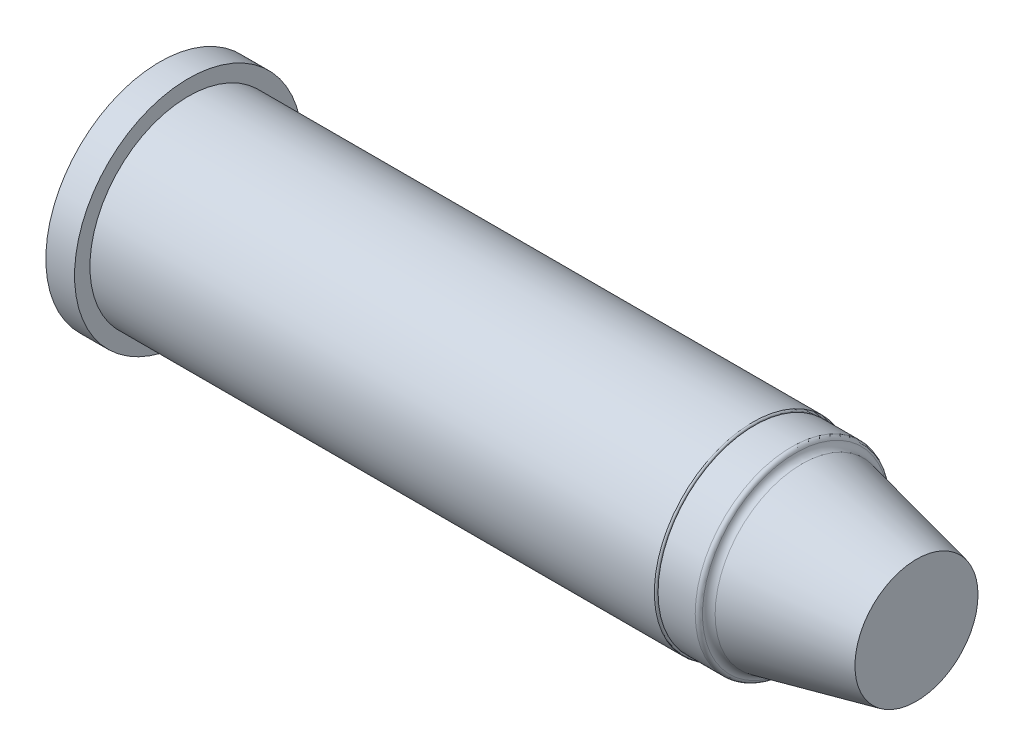
ISO-10303-21;
HEADER;
FILE_DESCRIPTION(('STEP AP214'),'2;1');
FILE_NAME('part.step','',(''),(''),'','','');
FILE_SCHEMA(('AUTOMOTIVE_DESIGN { 1 0 10303 214 1 1 1 1 }'));
ENDSEC;
DATA;
#1=APPLICATION_CONTEXT('core data for automotive mechanical design processes');
#2=APPLICATION_PROTOCOL_DEFINITION('international standard','automotive_design',2000,#1);
#3=PRODUCT_CONTEXT('',#1,'mechanical');
#4=PRODUCT('Part','Part','',(#3));
#5=PRODUCT_RELATED_PRODUCT_CATEGORY('part','',(#4));
#6=PRODUCT_DEFINITION_FORMATION('','',#4);
#7=PRODUCT_DEFINITION_CONTEXT('part definition',#1,'design');
#8=PRODUCT_DEFINITION('design','',#6,#7);
#9=PRODUCT_DEFINITION_SHAPE('','',#8);
#10=(LENGTH_UNIT() NAMED_UNIT(*) SI_UNIT(.MILLI.,.METRE.));
#11=(NAMED_UNIT(*) PLANE_ANGLE_UNIT() SI_UNIT($,.RADIAN.));
#12=(NAMED_UNIT(*) SI_UNIT($,.STERADIAN.) SOLID_ANGLE_UNIT());
#13=UNCERTAINTY_MEASURE_WITH_UNIT(LENGTH_MEASURE(1.E-05),#10,'distance_accuracy_value','');
#14=(GEOMETRIC_REPRESENTATION_CONTEXT(3) GLOBAL_UNCERTAINTY_ASSIGNED_CONTEXT((#13)) GLOBAL_UNIT_ASSIGNED_CONTEXT((#10,
#11,#12)) REPRESENTATION_CONTEXT('',''));
#15=CARTESIAN_POINT('',(0.,0.,0.));
#16=DIRECTION('',(0.,0.,1.));
#17=DIRECTION('',(1.,0.,0.));
#18=AXIS2_PLACEMENT_3D('',#15,#16,#17);
#19=CARTESIAN_POINT('',(36.9,7.67886241835827,0.));
#20=DIRECTION('',(1.,0.,0.));
#21=DIRECTION('',(0.,0.,-1.));
#22=AXIS2_PLACEMENT_3D('',#19,#20,#21);
#23=PLANE('',#22);
#24=CARTESIAN_POINT('',(36.9,4.67886241835826,0.));
#25=DIRECTION('',(1.,0.,0.));
#26=DIRECTION('',(0.,0.,-1.));
#27=AXIS2_PLACEMENT_3D('',#24,#25,#26);
#28=CIRCLE('',#27,3.);
#29=CARTESIAN_POINT('',(36.9,4.67886241835826,-3.));
#30=VERTEX_POINT('',#29);
#31=EDGE_CURVE('E47',#30,#30,#28,.T.);
#32=ORIENTED_EDGE('',*,*,#31,.T.);
#33=EDGE_LOOP('',(#32));
#34=FACE_BOUND('',#33,.T.);
#35=ADVANCED_FACE('F36',(#34),#23,.T.);
#36=CARTESIAN_POINT('',(36.9,4.67886241835826,0.));
#37=DIRECTION('',(-1.,0.,0.));
#38=DIRECTION('',(0.,0.,1.));
#39=AXIS2_PLACEMENT_3D('',#36,#37,#38);
#40=CONICAL_SURFACE('',#39,3.,0.216873615666408);
#41=CARTESIAN_POINT('',(31.3139289875854,4.67886241835826,0.));
#42=DIRECTION('',(1.,0.,0.));
#43=DIRECTION('',(0.,0.,-1.));
#44=AXIS2_PLACEMENT_3D('',#41,#42,#43);
#45=CIRCLE('',#44,4.23082920612526);
#46=CARTESIAN_POINT('',(31.3139289875854,4.67886241835826,-4.23082920612526));
#47=VERTEX_POINT('',#46);
#48=EDGE_CURVE('E51',#47,#47,#45,.T.);
#49=ORIENTED_EDGE('',*,*,#48,.T.);
#50=EDGE_LOOP('',(#49));
#51=FACE_BOUND('',#50,.T.);
#52=ORIENTED_EDGE('',*,*,#31,.F.);
#53=EDGE_LOOP('',(#52));
#54=FACE_BOUND('',#53,.T.);
#55=ADVANCED_FACE('F89',(#51,#54),#40,.T.);
#56=CARTESIAN_POINT('',(31.4,4.67886241835826,0.));
#57=DIRECTION('',(1.,0.,0.));
#58=DIRECTION('',(0.,0.,-1.));
#59=AXIS2_PLACEMENT_3D('',#56,#57,#58);
#60=TOROIDAL_SURFACE('',#59,4.62145918554558,0.399999999999998);
#61=CARTESIAN_POINT('',(31.0082814693932,4.67886241835826,0.));
#62=DIRECTION('',(1.,0.,0.));
#63=DIRECTION('',(0.,0.,-1.));
#64=AXIS2_PLACEMENT_3D('',#61,#62,#63);
#65=CIRCLE('',#64,4.54048639518185);
#66=CARTESIAN_POINT('',(31.0082814693932,4.67886241835826,-4.54048639518185));
#67=VERTEX_POINT('',#66);
#68=EDGE_CURVE('E43',#67,#67,#65,.T.);
#69=ORIENTED_EDGE('',*,*,#68,.T.);
#70=EDGE_LOOP('',(#69));
#71=FACE_BOUND('',#70,.T.);
#72=ORIENTED_EDGE('',*,*,#48,.F.);
#73=EDGE_LOOP('',(#72));
#74=FACE_BOUND('',#73,.T.);
#75=ADVANCED_FACE('F94',(#71,#74),#60,.F.);
#76=CARTESIAN_POINT('',(36.9,4.67886241835826,0.));
#77=DIRECTION('',(1.,0.,0.));
#78=DIRECTION('',(0.,0.,-1.));
#79=AXIS2_PLACEMENT_3D('',#76,#77,#78);
#80=CYLINDRICAL_SURFACE('',#79,4.7);
#81=CARTESIAN_POINT('',(30.8124222040899,4.67886241835826,0.));
#82=DIRECTION('',(-1.,0.,0.));
#83=DIRECTION('',(0.,0.,1.));
#84=AXIS2_PLACEMENT_3D('',#81,#82,#83);
#85=CIRCLE('',#84,4.7);
#86=CARTESIAN_POINT('',(30.8124222040899,4.67886241835826,4.7));
#87=VERTEX_POINT('',#86);
#88=EDGE_CURVE('E10',#87,#87,#85,.T.);
#89=ORIENTED_EDGE('',*,*,#88,.T.);
#90=EDGE_LOOP('',(#89));
#91=FACE_BOUND('',#90,.T.);
#92=CARTESIAN_POINT('',(29.,4.67886241835826,0.));
#93=DIRECTION('',(1.,0.,0.));
#94=DIRECTION('',(0.,0.,-1.));
#95=AXIS2_PLACEMENT_3D('',#92,#93,#94);
#96=CIRCLE('',#95,4.7);
#97=CARTESIAN_POINT('',(29.,4.67886241835826,-4.7));
#98=VERTEX_POINT('',#97);
#99=EDGE_CURVE('E56',#98,#98,#96,.T.);
#100=ORIENTED_EDGE('',*,*,#99,.T.);
#101=EDGE_LOOP('',(#100));
#102=FACE_BOUND('',#101,.T.);
#103=ADVANCED_FACE('F100',(#91,#102),#80,.T.);
#104=CARTESIAN_POINT('',(29.,9.37886241835827,0.));
#105=DIRECTION('',(1.,0.,0.));
#106=DIRECTION('',(0.,0.,-1.));
#107=AXIS2_PLACEMENT_3D('',#104,#105,#106);
#108=PLANE('',#107);
#109=CARTESIAN_POINT('',(29.,4.67886241835826,0.));
#110=DIRECTION('',(1.,0.,0.));
#111=DIRECTION('',(0.,0.,-1.));
#112=AXIS2_PLACEMENT_3D('',#109,#110,#111);
#113=CIRCLE('',#112,4.72);
#114=CARTESIAN_POINT('',(29.,4.67886241835826,-4.72));
#115=VERTEX_POINT('',#114);
#116=EDGE_CURVE('E59',#115,#115,#113,.T.);
#117=ORIENTED_EDGE('',*,*,#116,.T.);
#118=EDGE_LOOP('',(#117));
#119=FACE_BOUND('',#118,.T.);
#120=ORIENTED_EDGE('',*,*,#99,.F.);
#121=EDGE_LOOP('',(#120));
#122=FACE_BOUND('',#121,.T.);
#123=ADVANCED_FACE('F103',(#119,#122),#108,.T.);
#124=CARTESIAN_POINT('',(28.92,4.67886241835826,0.));
#125=DIRECTION('',(1.,0.,0.));
#126=DIRECTION('',(0.,0.,-1.));
#127=AXIS2_PLACEMENT_3D('',#124,#125,#126);
#128=TOROIDAL_SURFACE('',#127,4.72,0.0800000000000002);
#129=CARTESIAN_POINT('',(28.92,4.67886241835826,0.));
#130=DIRECTION('',(1.,0.,0.));
#131=DIRECTION('',(0.,0.,-1.));
#132=AXIS2_PLACEMENT_3D('',#129,#130,#131);
#133=CIRCLE('',#132,4.8);
#134=CARTESIAN_POINT('',(28.92,4.67886241835826,-4.8));
#135=VERTEX_POINT('',#134);
#136=EDGE_CURVE('E62',#135,#135,#133,.T.);
#137=ORIENTED_EDGE('',*,*,#136,.T.);
#138=EDGE_LOOP('',(#137));
#139=FACE_BOUND('',#138,.T.);
#140=ORIENTED_EDGE('',*,*,#116,.F.);
#141=EDGE_LOOP('',(#140));
#142=FACE_BOUND('',#141,.T.);
#143=ADVANCED_FACE('F106',(#139,#142),#128,.T.);
#144=CARTESIAN_POINT('',(36.9,4.67886241835826,0.));
#145=DIRECTION('',(1.,0.,0.));
#146=DIRECTION('',(0.,0.,-1.));
#147=AXIS2_PLACEMENT_3D('',#144,#145,#146);
#148=CYLINDRICAL_SURFACE('',#147,4.8);
#149=CARTESIAN_POINT('',(1.4,4.67886241835826,0.));
#150=DIRECTION('',(1.,0.,0.));
#151=DIRECTION('',(0.,0.,-1.));
#152=AXIS2_PLACEMENT_3D('',#149,#150,#151);
#153=CIRCLE('',#152,4.8);
#154=CARTESIAN_POINT('',(1.4,4.67886241835826,-4.8));
#155=VERTEX_POINT('',#154);
#156=EDGE_CURVE('E65',#155,#155,#153,.T.);
#157=ORIENTED_EDGE('',*,*,#156,.T.);
#158=EDGE_LOOP('',(#157));
#159=FACE_BOUND('',#158,.T.);
#160=ORIENTED_EDGE('',*,*,#136,.F.);
#161=EDGE_LOOP('',(#160));
#162=FACE_BOUND('',#161,.T.);
#163=ADVANCED_FACE('F110',(#159,#162),#148,.T.);
#164=CARTESIAN_POINT('',(1.4,10.2288624183583,0.));
#165=DIRECTION('',(1.,0.,0.));
#166=DIRECTION('',(0.,0.,-1.));
#167=AXIS2_PLACEMENT_3D('',#164,#165,#166);
#168=PLANE('',#167);
#169=CARTESIAN_POINT('',(1.4,4.67886241835826,0.));
#170=DIRECTION('',(1.,0.,0.));
#171=DIRECTION('',(0.,0.,-1.));
#172=AXIS2_PLACEMENT_3D('',#169,#170,#171);
#173=CIRCLE('',#172,5.55);
#174=CARTESIAN_POINT('',(1.4,4.67886241835826,-5.55));
#175=VERTEX_POINT('',#174);
#176=EDGE_CURVE('E68',#175,#175,#173,.T.);
#177=ORIENTED_EDGE('',*,*,#176,.T.);
#178=EDGE_LOOP('',(#177));
#179=FACE_BOUND('',#178,.T.);
#180=ORIENTED_EDGE('',*,*,#156,.F.);
#181=EDGE_LOOP('',(#180));
#182=FACE_BOUND('',#181,.T.);
#183=ADVANCED_FACE('F86',(#179,#182),#168,.T.);
#184=CARTESIAN_POINT('',(36.9,4.67886241835826,0.));
#185=DIRECTION('',(1.,0.,0.));
#186=DIRECTION('',(0.,0.,-1.));
#187=AXIS2_PLACEMENT_3D('',#184,#185,#186);
#188=CYLINDRICAL_SURFACE('',#187,5.55);
#189=CARTESIAN_POINT('',(0.,4.67886241835826,0.));
#190=DIRECTION('',(1.,0.,0.));
#191=DIRECTION('',(0.,0.,-1.));
#192=AXIS2_PLACEMENT_3D('',#189,#190,#191);
#193=CIRCLE('',#192,5.55);
#194=CARTESIAN_POINT('',(0.,4.67886241835826,-5.55));
#195=VERTEX_POINT('',#194);
#196=EDGE_CURVE('E71',#195,#195,#193,.T.);
#197=ORIENTED_EDGE('',*,*,#196,.T.);
#198=EDGE_LOOP('',(#197));
#199=FACE_BOUND('',#198,.T.);
#200=ORIENTED_EDGE('',*,*,#176,.F.);
#201=EDGE_LOOP('',(#200));
#202=FACE_BOUND('',#201,.T.);
#203=ADVANCED_FACE('F75',(#199,#202),#188,.T.);
#204=CARTESIAN_POINT('',(0.,4.67886241835826,0.));
#205=DIRECTION('',(-1.,0.,0.));
#206=DIRECTION('',(0.,0.,1.));
#207=AXIS2_PLACEMENT_3D('',#204,#205,#206);
#208=PLANE('',#207);
#209=ORIENTED_EDGE('',*,*,#196,.F.);
#210=EDGE_LOOP('',(#209));
#211=FACE_BOUND('',#210,.T.);
#212=ADVANCED_FACE('F78',(#211),#208,.T.);
#213=CARTESIAN_POINT('',(30.8124222040899,4.67886241835826,0.));
#214=DIRECTION('',(-1.,0.,0.));
#215=DIRECTION('',(0.,0.,1.));
#216=AXIS2_PLACEMENT_3D('',#213,#214,#215);
#217=TOROIDAL_SURFACE('',#216,4.5,0.2);
#218=ORIENTED_EDGE('',*,*,#88,.F.);
#219=EDGE_LOOP('',(#218));
#220=FACE_BOUND('',#219,.T.);
#221=ORIENTED_EDGE('',*,*,#68,.F.);
#222=EDGE_LOOP('',(#221));
#223=FACE_BOUND('',#222,.T.);
#224=ADVANCED_FACE('F38',(#220,#223),#217,.T.);
#225=CLOSED_SHELL('',(#35,#55,#75,#103,#123,#143,#163,#183,#203,#212,#224));
#226=MANIFOLD_SOLID_BREP('B2',#225);
#227=ADVANCED_BREP_SHAPE_REPRESENTATION('',(#18,#226),#14);
#228=SHAPE_DEFINITION_REPRESENTATION(#9,#227);
ENDSEC;
END-ISO-10303-21;
